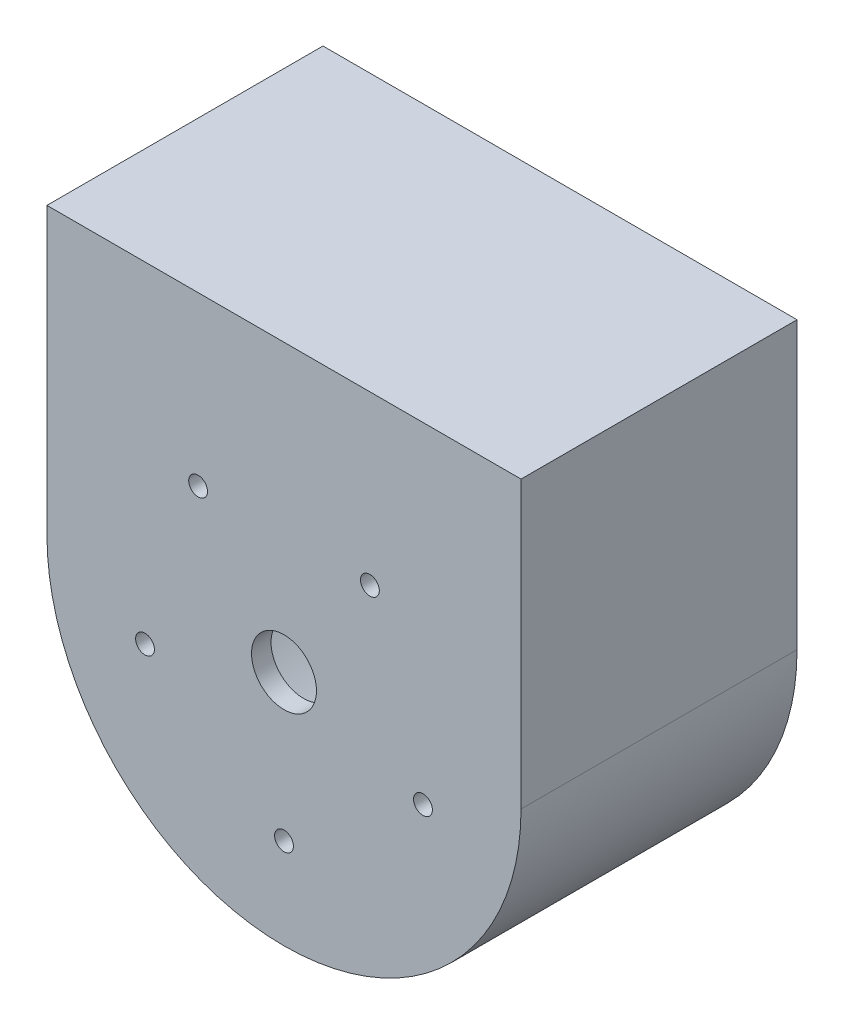
ISO-10303-21;
HEADER;
FILE_DESCRIPTION(('STEP AP214'),'2;1');
FILE_NAME('part.step','',(''),(''),'','','');
FILE_SCHEMA(('AUTOMOTIVE_DESIGN { 1 0 10303 214 1 1 1 1 }'));
ENDSEC;
DATA;
#1=APPLICATION_CONTEXT('core data for automotive mechanical design processes');
#2=APPLICATION_PROTOCOL_DEFINITION('international standard','automotive_design',2000,#1);
#3=PRODUCT_CONTEXT('',#1,'mechanical');
#4=PRODUCT('Part','Part','',(#3));
#5=PRODUCT_RELATED_PRODUCT_CATEGORY('part','',(#4));
#6=PRODUCT_DEFINITION_FORMATION('','',#4);
#7=PRODUCT_DEFINITION_CONTEXT('part definition',#1,'design');
#8=PRODUCT_DEFINITION('design','',#6,#7);
#9=PRODUCT_DEFINITION_SHAPE('','',#8);
#10=(LENGTH_UNIT() NAMED_UNIT(*) SI_UNIT(.MILLI.,.METRE.));
#11=(NAMED_UNIT(*) PLANE_ANGLE_UNIT() SI_UNIT($,.RADIAN.));
#12=(NAMED_UNIT(*) SI_UNIT($,.STERADIAN.) SOLID_ANGLE_UNIT());
#13=UNCERTAINTY_MEASURE_WITH_UNIT(LENGTH_MEASURE(1.E-05),#10,'distance_accuracy_value','');
#14=(GEOMETRIC_REPRESENTATION_CONTEXT(3) GLOBAL_UNCERTAINTY_ASSIGNED_CONTEXT((#13)) GLOBAL_UNIT_ASSIGNED_CONTEXT((#10,
#11,#12)) REPRESENTATION_CONTEXT('',''));
#15=CARTESIAN_POINT('',(0.,0.,0.));
#16=DIRECTION('',(0.,0.,1.));
#17=DIRECTION('',(1.,0.,0.));
#18=AXIS2_PLACEMENT_3D('',#15,#16,#17);
#19=CARTESIAN_POINT('',(300.,300.,389.5));
#20=DIRECTION('',(0.,0.,1.));
#21=DIRECTION('',(1.,0.,0.));
#22=AXIS2_PLACEMENT_3D('',#19,#20,#21);
#23=PLANE('',#22);
#24=CARTESIAN_POINT('',(300.,300.,389.5));
#25=DIRECTION('',(0.,0.,1.));
#26=DIRECTION('',(1.,0.,0.));
#27=AXIS2_PLACEMENT_3D('',#24,#25,#26);
#28=CIRCLE('',#27,31.5);
#29=CARTESIAN_POINT('',(268.5,300.,389.5));
#30=VERTEX_POINT('',#29);
#31=CARTESIAN_POINT('',(331.5,300.,389.5));
#32=VERTEX_POINT('',#31);
#33=EDGE_CURVE('E118',#30,#32,#28,.T.);
#34=ORIENTED_EDGE('',*,*,#33,.F.);
#35=DIRECTION('',(0.,-1.,0.));
#36=VECTOR('',#35,1.);
#37=CARTESIAN_POINT('',(268.5,341.5,389.5));
#38=LINE('',#37,#36);
#39=CARTESIAN_POINT('',(268.5,341.5,389.5));
#40=VERTEX_POINT('',#39);
#41=EDGE_CURVE('E104',#40,#30,#38,.T.);
#42=ORIENTED_EDGE('',*,*,#41,.F.);
#43=DIRECTION('',(-1.,0.,0.));
#44=VECTOR('',#43,1.);
#45=CARTESIAN_POINT('',(331.5,341.5,389.5));
#46=LINE('',#45,#44);
#47=CARTESIAN_POINT('',(331.5,341.5,389.5));
#48=VERTEX_POINT('',#47);
#49=EDGE_CURVE('E323',#48,#40,#46,.T.);
#50=ORIENTED_EDGE('',*,*,#49,.F.);
#51=DIRECTION('',(0.,1.,0.));
#52=VECTOR('',#51,1.);
#53=CARTESIAN_POINT('',(331.5,300.,389.5));
#54=LINE('',#53,#52);
#55=EDGE_CURVE('E54',#32,#48,#54,.T.);
#56=ORIENTED_EDGE('',*,*,#55,.F.);
#57=EDGE_LOOP('',(#34,#42,#50,#56));
#58=FACE_BOUND('',#57,.T.);
#59=CARTESIAN_POINT('',(313.225168176581,318.202882373436,389.5));
#60=DIRECTION('',(0.,0.,1.));
#61=DIRECTION('',(1.,0.,0.));
#62=AXIS2_PLACEMENT_3D('',#59,#60,#61);
#63=CIRCLE('',#62,1.45000000000001);
#64=CARTESIAN_POINT('',(314.675168176581,318.202882373436,389.5));
#65=VERTEX_POINT('',#64);
#66=EDGE_CURVE('E339',#65,#65,#63,.T.);
#67=ORIENTED_EDGE('',*,*,#66,.T.);
#68=EDGE_LOOP('',(#67));
#69=FACE_BOUND('',#68,.T.);
#70=CARTESIAN_POINT('',(321.398771616641,293.047117626564,389.5));
#71=DIRECTION('',(0.,0.,1.));
#72=DIRECTION('',(1.,0.,0.));
#73=AXIS2_PLACEMENT_3D('',#70,#71,#72);
#74=CIRCLE('',#73,1.45000000000001);
#75=CARTESIAN_POINT('',(322.848771616641,293.047117626564,389.5));
#76=VERTEX_POINT('',#75);
#77=EDGE_CURVE('E338',#76,#76,#74,.T.);
#78=ORIENTED_EDGE('',*,*,#77,.T.);
#79=EDGE_LOOP('',(#78));
#80=FACE_BOUND('',#79,.T.);
#81=CARTESIAN_POINT('',(300.,277.5,389.5));
#82=DIRECTION('',(0.,0.,1.));
#83=DIRECTION('',(1.,0.,0.));
#84=AXIS2_PLACEMENT_3D('',#81,#82,#83);
#85=CIRCLE('',#84,1.45000000000001);
#86=CARTESIAN_POINT('',(301.45,277.5,389.5));
#87=VERTEX_POINT('',#86);
#88=EDGE_CURVE('E345',#87,#87,#85,.T.);
#89=ORIENTED_EDGE('',*,*,#88,.T.);
#90=EDGE_LOOP('',(#89));
#91=FACE_BOUND('',#90,.T.);
#92=CARTESIAN_POINT('',(278.601228383359,293.047117626564,389.5));
#93=DIRECTION('',(0.,0.,1.));
#94=DIRECTION('',(1.,0.,0.));
#95=AXIS2_PLACEMENT_3D('',#92,#93,#94);
#96=CIRCLE('',#95,1.45000000000001);
#97=CARTESIAN_POINT('',(280.051228383359,293.047117626564,389.5));
#98=VERTEX_POINT('',#97);
#99=EDGE_CURVE('E351',#98,#98,#96,.T.);
#100=ORIENTED_EDGE('',*,*,#99,.T.);
#101=EDGE_LOOP('',(#100));
#102=FACE_BOUND('',#101,.T.);
#103=CARTESIAN_POINT('',(286.774831823419,318.202882373436,389.5));
#104=DIRECTION('',(0.,0.,1.));
#105=DIRECTION('',(1.,0.,0.));
#106=AXIS2_PLACEMENT_3D('',#103,#104,#105);
#107=CIRCLE('',#106,1.45000000000001);
#108=CARTESIAN_POINT('',(288.224831823419,318.202882373436,389.5));
#109=VERTEX_POINT('',#108);
#110=EDGE_CURVE('E313',#109,#109,#107,.T.);
#111=ORIENTED_EDGE('',*,*,#110,.T.);
#112=EDGE_LOOP('',(#111));
#113=FACE_BOUND('',#112,.T.);
#114=CARTESIAN_POINT('',(300.,300.,389.5));
#115=DIRECTION('',(0.,0.,1.));
#116=DIRECTION('',(1.,0.,0.));
#117=AXIS2_PLACEMENT_3D('',#114,#115,#116);
#118=CIRCLE('',#117,5.);
#119=CARTESIAN_POINT('',(305.,300.,389.5));
#120=VERTEX_POINT('',#119);
#121=EDGE_CURVE('E311',#120,#120,#118,.T.);
#122=ORIENTED_EDGE('',*,*,#121,.T.);
#123=EDGE_LOOP('',(#122));
#124=FACE_BOUND('',#123,.T.);
#125=ADVANCED_FACE('F39',(#58,#69,#80,#91,#102,#113,#124),#23,.F.);
#126=CARTESIAN_POINT('',(300.,300.,350.));
#127=DIRECTION('',(0.,0.,1.));
#128=DIRECTION('',(1.,0.,0.));
#129=AXIS2_PLACEMENT_3D('',#126,#127,#128);
#130=PLANE('',#129);
#131=CARTESIAN_POINT('',(300.,300.,350.));
#132=DIRECTION('',(0.,0.,1.));
#133=DIRECTION('',(1.,0.,0.));
#134=AXIS2_PLACEMENT_3D('',#131,#132,#133);
#135=CIRCLE('',#134,36.5);
#136=CARTESIAN_POINT('',(263.5,300.,350.));
#137=VERTEX_POINT('',#136);
#138=CARTESIAN_POINT('',(336.5,300.,350.));
#139=VERTEX_POINT('',#138);
#140=EDGE_CURVE('E43',#137,#139,#135,.T.);
#141=ORIENTED_EDGE('',*,*,#140,.F.);
#142=DIRECTION('',(0.,-1.,0.));
#143=VECTOR('',#142,1.);
#144=CARTESIAN_POINT('',(263.5,344.,350.));
#145=LINE('',#144,#143);
#146=CARTESIAN_POINT('',(263.5,344.,350.));
#147=VERTEX_POINT('',#146);
#148=EDGE_CURVE('E124',#147,#137,#145,.T.);
#149=ORIENTED_EDGE('',*,*,#148,.F.);
#150=DIRECTION('',(-1.,0.,0.));
#151=VECTOR('',#150,1.);
#152=CARTESIAN_POINT('',(336.5,344.,350.));
#153=LINE('',#152,#151);
#154=CARTESIAN_POINT('',(336.5,344.,350.));
#155=VERTEX_POINT('',#154);
#156=EDGE_CURVE('E135',#155,#147,#153,.T.);
#157=ORIENTED_EDGE('',*,*,#156,.F.);
#158=DIRECTION('',(0.,1.,0.));
#159=VECTOR('',#158,1.);
#160=CARTESIAN_POINT('',(336.5,300.,350.));
#161=LINE('',#160,#159);
#162=EDGE_CURVE('E127',#139,#155,#161,.T.);
#163=ORIENTED_EDGE('',*,*,#162,.F.);
#164=EDGE_LOOP('',(#141,#149,#157,#163));
#165=FACE_BOUND('',#164,.T.);
#166=DIRECTION('',(0.,-1.,0.));
#167=VECTOR('',#166,1.);
#168=CARTESIAN_POINT('',(268.5,341.5,350.));
#169=LINE('',#168,#167);
#170=CARTESIAN_POINT('',(268.5,341.5,350.));
#171=VERTEX_POINT('',#170);
#172=CARTESIAN_POINT('',(268.5,300.,350.));
#173=VERTEX_POINT('',#172);
#174=EDGE_CURVE('E315',#171,#173,#169,.T.);
#175=ORIENTED_EDGE('',*,*,#174,.T.);
#176=CARTESIAN_POINT('',(300.,300.,350.));
#177=DIRECTION('',(0.,0.,1.));
#178=DIRECTION('',(1.,0.,0.));
#179=AXIS2_PLACEMENT_3D('',#176,#177,#178);
#180=CIRCLE('',#179,31.5);
#181=CARTESIAN_POINT('',(331.5,300.,350.));
#182=VERTEX_POINT('',#181);
#183=EDGE_CURVE('E120',#173,#182,#180,.T.);
#184=ORIENTED_EDGE('',*,*,#183,.T.);
#185=DIRECTION('',(0.,1.,0.));
#186=VECTOR('',#185,1.);
#187=CARTESIAN_POINT('',(331.5,300.,350.));
#188=LINE('',#187,#186);
#189=CARTESIAN_POINT('',(331.5,341.5,350.));
#190=VERTEX_POINT('',#189);
#191=EDGE_CURVE('E326',#182,#190,#188,.T.);
#192=ORIENTED_EDGE('',*,*,#191,.T.);
#193=DIRECTION('',(-1.,0.,0.));
#194=VECTOR('',#193,1.);
#195=CARTESIAN_POINT('',(331.5,341.5,350.));
#196=LINE('',#195,#194);
#197=EDGE_CURVE('E111',#190,#171,#196,.T.);
#198=ORIENTED_EDGE('',*,*,#197,.T.);
#199=EDGE_LOOP('',(#175,#184,#192,#198));
#200=FACE_BOUND('',#199,.T.);
#201=ADVANCED_FACE('F160',(#165,#200),#130,.F.);
#202=CARTESIAN_POINT('',(300.,300.,389.5));
#203=DIRECTION('',(0.,0.,-1.));
#204=DIRECTION('',(-1.,0.,0.));
#205=AXIS2_PLACEMENT_3D('',#202,#203,#204);
#206=CYLINDRICAL_SURFACE('',#205,31.5);
#207=ORIENTED_EDGE('',*,*,#183,.F.);
#208=DIRECTION('',(0.,0.,-1.));
#209=VECTOR('',#208,1.);
#210=CARTESIAN_POINT('',(268.5,300.,389.5));
#211=LINE('',#210,#209);
#212=EDGE_CURVE('E108',#30,#173,#211,.T.);
#213=ORIENTED_EDGE('',*,*,#212,.F.);
#214=ORIENTED_EDGE('',*,*,#33,.T.);
#215=DIRECTION('',(0.,0.,-1.));
#216=VECTOR('',#215,1.);
#217=CARTESIAN_POINT('',(331.5,300.,389.5));
#218=LINE('',#217,#216);
#219=EDGE_CURVE('E121',#32,#182,#218,.T.);
#220=ORIENTED_EDGE('',*,*,#219,.T.);
#221=EDGE_LOOP('',(#207,#213,#214,#220));
#222=FACE_BOUND('',#221,.T.);
#223=ADVANCED_FACE('F116',(#222),#206,.F.);
#224=CARTESIAN_POINT('',(300.,300.,392.5));
#225=DIRECTION('',(0.,0.,-1.));
#226=DIRECTION('',(-1.,0.,0.));
#227=AXIS2_PLACEMENT_3D('',#224,#225,#226);
#228=CYLINDRICAL_SURFACE('',#227,36.5);
#229=DIRECTION('',(0.,0.,-1.));
#230=VECTOR('',#229,1.);
#231=CARTESIAN_POINT('',(263.5,300.,392.5));
#232=LINE('',#231,#230);
#233=CARTESIAN_POINT('',(263.5,300.,392.5));
#234=VERTEX_POINT('',#233);
#235=EDGE_CURVE('E150',#234,#137,#232,.T.);
#236=ORIENTED_EDGE('',*,*,#235,.T.);
#237=ORIENTED_EDGE('',*,*,#140,.T.);
#238=DIRECTION('',(0.,0.,-1.));
#239=VECTOR('',#238,1.);
#240=CARTESIAN_POINT('',(336.5,300.,392.5));
#241=LINE('',#240,#239);
#242=CARTESIAN_POINT('',(336.5,300.,392.5));
#243=VERTEX_POINT('',#242);
#244=EDGE_CURVE('E147',#243,#139,#241,.T.);
#245=ORIENTED_EDGE('',*,*,#244,.F.);
#246=CARTESIAN_POINT('',(300.,300.,392.5));
#247=DIRECTION('',(0.,0.,1.));
#248=DIRECTION('',(1.,0.,0.));
#249=AXIS2_PLACEMENT_3D('',#246,#247,#248);
#250=CIRCLE('',#249,36.5);
#251=EDGE_CURVE('E11',#234,#243,#250,.T.);
#252=ORIENTED_EDGE('',*,*,#251,.F.);
#253=EDGE_LOOP('',(#236,#237,#245,#252));
#254=FACE_BOUND('',#253,.T.);
#255=ADVANCED_FACE('F41',(#254),#228,.T.);
#256=CARTESIAN_POINT('',(300.,300.,392.5));
#257=DIRECTION('',(0.,0.,1.));
#258=DIRECTION('',(1.,0.,0.));
#259=AXIS2_PLACEMENT_3D('',#256,#257,#258);
#260=PLANE('',#259);
#261=CARTESIAN_POINT('',(286.774831823419,318.202882373436,392.5));
#262=DIRECTION('',(0.,0.,1.));
#263=DIRECTION('',(1.,0.,0.));
#264=AXIS2_PLACEMENT_3D('',#261,#262,#263);
#265=CIRCLE('',#264,1.45000000000001);
#266=CARTESIAN_POINT('',(288.224831823419,318.202882373436,392.5));
#267=VERTEX_POINT('',#266);
#268=EDGE_CURVE('E318',#267,#267,#265,.T.);
#269=ORIENTED_EDGE('',*,*,#268,.F.);
#270=EDGE_LOOP('',(#269));
#271=FACE_BOUND('',#270,.T.);
#272=CARTESIAN_POINT('',(278.601228383359,293.047117626564,392.5));
#273=DIRECTION('',(0.,0.,1.));
#274=DIRECTION('',(1.,0.,0.));
#275=AXIS2_PLACEMENT_3D('',#272,#273,#274);
#276=CIRCLE('',#275,1.45000000000001);
#277=CARTESIAN_POINT('',(280.051228383359,293.047117626564,392.5));
#278=VERTEX_POINT('',#277);
#279=EDGE_CURVE('E348',#278,#278,#276,.T.);
#280=ORIENTED_EDGE('',*,*,#279,.F.);
#281=EDGE_LOOP('',(#280));
#282=FACE_BOUND('',#281,.T.);
#283=CARTESIAN_POINT('',(300.,277.5,392.5));
#284=DIRECTION('',(0.,0.,1.));
#285=DIRECTION('',(1.,0.,0.));
#286=AXIS2_PLACEMENT_3D('',#283,#284,#285);
#287=CIRCLE('',#286,1.45000000000001);
#288=CARTESIAN_POINT('',(301.45,277.5,392.5));
#289=VERTEX_POINT('',#288);
#290=EDGE_CURVE('E342',#289,#289,#287,.T.);
#291=ORIENTED_EDGE('',*,*,#290,.F.);
#292=EDGE_LOOP('',(#291));
#293=FACE_BOUND('',#292,.T.);
#294=CARTESIAN_POINT('',(321.398771616641,293.047117626564,392.5));
#295=DIRECTION('',(0.,0.,1.));
#296=DIRECTION('',(1.,0.,0.));
#297=AXIS2_PLACEMENT_3D('',#294,#295,#296);
#298=CIRCLE('',#297,1.45000000000001);
#299=CARTESIAN_POINT('',(322.848771616641,293.047117626564,392.5));
#300=VERTEX_POINT('',#299);
#301=EDGE_CURVE('E335',#300,#300,#298,.T.);
#302=ORIENTED_EDGE('',*,*,#301,.F.);
#303=EDGE_LOOP('',(#302));
#304=FACE_BOUND('',#303,.T.);
#305=CARTESIAN_POINT('',(313.225168176581,318.202882373436,392.5));
#306=DIRECTION('',(0.,0.,1.));
#307=DIRECTION('',(1.,0.,0.));
#308=AXIS2_PLACEMENT_3D('',#305,#306,#307);
#309=CIRCLE('',#308,1.45000000000001);
#310=CARTESIAN_POINT('',(314.675168176581,318.202882373436,392.5));
#311=VERTEX_POINT('',#310);
#312=EDGE_CURVE('E356',#311,#311,#309,.T.);
#313=ORIENTED_EDGE('',*,*,#312,.F.);
#314=EDGE_LOOP('',(#313));
#315=FACE_BOUND('',#314,.T.);
#316=CARTESIAN_POINT('',(300.,300.,392.5));
#317=DIRECTION('',(0.,0.,1.));
#318=DIRECTION('',(1.,0.,0.));
#319=AXIS2_PLACEMENT_3D('',#316,#317,#318);
#320=CIRCLE('',#319,5.);
#321=CARTESIAN_POINT('',(305.,300.,392.5));
#322=VERTEX_POINT('',#321);
#323=EDGE_CURVE('E308',#322,#322,#320,.T.);
#324=ORIENTED_EDGE('',*,*,#323,.F.);
#325=EDGE_LOOP('',(#324));
#326=FACE_BOUND('',#325,.T.);
#327=ORIENTED_EDGE('',*,*,#251,.T.);
#328=DIRECTION('',(0.,1.,0.));
#329=VECTOR('',#328,1.);
#330=CARTESIAN_POINT('',(336.5,300.,392.5));
#331=LINE('',#330,#329);
#332=CARTESIAN_POINT('',(336.5,344.,392.5));
#333=VERTEX_POINT('',#332);
#334=EDGE_CURVE('E134',#243,#333,#331,.T.);
#335=ORIENTED_EDGE('',*,*,#334,.T.);
#336=DIRECTION('',(-1.,0.,0.));
#337=VECTOR('',#336,1.);
#338=CARTESIAN_POINT('',(336.5,344.,392.5));
#339=LINE('',#338,#337);
#340=CARTESIAN_POINT('',(263.5,344.,392.5));
#341=VERTEX_POINT('',#340);
#342=EDGE_CURVE('E137',#333,#341,#339,.T.);
#343=ORIENTED_EDGE('',*,*,#342,.T.);
#344=DIRECTION('',(0.,-1.,0.));
#345=VECTOR('',#344,1.);
#346=CARTESIAN_POINT('',(263.5,344.,392.5));
#347=LINE('',#346,#345);
#348=EDGE_CURVE('E132',#341,#234,#347,.T.);
#349=ORIENTED_EDGE('',*,*,#348,.T.);
#350=EDGE_LOOP('',(#327,#335,#343,#349));
#351=FACE_BOUND('',#350,.T.);
#352=ADVANCED_FACE('F170',(#271,#282,#293,#304,#315,#326,#351),#260,.T.);
#353=CARTESIAN_POINT('',(263.5,344.,392.5));
#354=DIRECTION('',(1.,0.,0.));
#355=DIRECTION('',(0.,0.,-1.));
#356=AXIS2_PLACEMENT_3D('',#353,#354,#355);
#357=PLANE('',#356);
#358=ORIENTED_EDGE('',*,*,#148,.T.);
#359=ORIENTED_EDGE('',*,*,#235,.F.);
#360=ORIENTED_EDGE('',*,*,#348,.F.);
#361=DIRECTION('',(0.,0.,-1.));
#362=VECTOR('',#361,1.);
#363=CARTESIAN_POINT('',(263.5,344.,392.5));
#364=LINE('',#363,#362);
#365=EDGE_CURVE('E138',#341,#147,#364,.T.);
#366=ORIENTED_EDGE('',*,*,#365,.T.);
#367=EDGE_LOOP('',(#358,#359,#360,#366));
#368=FACE_BOUND('',#367,.T.);
#369=ADVANCED_FACE('F168',(#368),#357,.F.);
#370=CARTESIAN_POINT('',(336.5,300.,392.5));
#371=DIRECTION('',(-1.,0.,0.));
#372=DIRECTION('',(0.,0.,1.));
#373=AXIS2_PLACEMENT_3D('',#370,#371,#372);
#374=PLANE('',#373);
#375=ORIENTED_EDGE('',*,*,#162,.T.);
#376=DIRECTION('',(0.,0.,-1.));
#377=VECTOR('',#376,1.);
#378=CARTESIAN_POINT('',(336.5,344.,392.5));
#379=LINE('',#378,#377);
#380=EDGE_CURVE('E144',#333,#155,#379,.T.);
#381=ORIENTED_EDGE('',*,*,#380,.F.);
#382=ORIENTED_EDGE('',*,*,#334,.F.);
#383=ORIENTED_EDGE('',*,*,#244,.T.);
#384=EDGE_LOOP('',(#375,#381,#382,#383));
#385=FACE_BOUND('',#384,.T.);
#386=ADVANCED_FACE('F157',(#385),#374,.F.);
#387=CARTESIAN_POINT('',(336.5,344.,392.5));
#388=DIRECTION('',(0.,-1.,0.));
#389=DIRECTION('',(0.,0.,-1.));
#390=AXIS2_PLACEMENT_3D('',#387,#388,#389);
#391=PLANE('',#390);
#392=ORIENTED_EDGE('',*,*,#156,.T.);
#393=ORIENTED_EDGE('',*,*,#365,.F.);
#394=ORIENTED_EDGE('',*,*,#342,.F.);
#395=ORIENTED_EDGE('',*,*,#380,.T.);
#396=EDGE_LOOP('',(#392,#393,#394,#395));
#397=FACE_BOUND('',#396,.T.);
#398=ADVANCED_FACE('F164',(#397),#391,.F.);
#399=CARTESIAN_POINT('',(268.5,341.5,389.5));
#400=DIRECTION('',(1.,0.,0.));
#401=DIRECTION('',(0.,0.,-1.));
#402=AXIS2_PLACEMENT_3D('',#399,#400,#401);
#403=PLANE('',#402);
#404=ORIENTED_EDGE('',*,*,#174,.F.);
#405=DIRECTION('',(0.,0.,-1.));
#406=VECTOR('',#405,1.);
#407=CARTESIAN_POINT('',(268.5,341.5,389.5));
#408=LINE('',#407,#406);
#409=EDGE_CURVE('E110',#40,#171,#408,.T.);
#410=ORIENTED_EDGE('',*,*,#409,.F.);
#411=ORIENTED_EDGE('',*,*,#41,.T.);
#412=ORIENTED_EDGE('',*,*,#212,.T.);
#413=EDGE_LOOP('',(#404,#410,#411,#412));
#414=FACE_BOUND('',#413,.T.);
#415=ADVANCED_FACE('F107',(#414),#403,.T.);
#416=CARTESIAN_POINT('',(331.5,300.,389.5));
#417=DIRECTION('',(-1.,0.,0.));
#418=DIRECTION('',(0.,0.,1.));
#419=AXIS2_PLACEMENT_3D('',#416,#417,#418);
#420=PLANE('',#419);
#421=ORIENTED_EDGE('',*,*,#191,.F.);
#422=ORIENTED_EDGE('',*,*,#219,.F.);
#423=ORIENTED_EDGE('',*,*,#55,.T.);
#424=DIRECTION('',(0.,0.,-1.));
#425=VECTOR('',#424,1.);
#426=CARTESIAN_POINT('',(331.5,341.5,389.5));
#427=LINE('',#426,#425);
#428=EDGE_CURVE('E332',#48,#190,#427,.T.);
#429=ORIENTED_EDGE('',*,*,#428,.T.);
#430=EDGE_LOOP('',(#421,#422,#423,#429));
#431=FACE_BOUND('',#430,.T.);
#432=ADVANCED_FACE('F221',(#431),#420,.T.);
#433=CARTESIAN_POINT('',(331.5,341.5,389.5));
#434=DIRECTION('',(0.,-1.,0.));
#435=DIRECTION('',(0.,0.,-1.));
#436=AXIS2_PLACEMENT_3D('',#433,#434,#435);
#437=PLANE('',#436);
#438=ORIENTED_EDGE('',*,*,#197,.F.);
#439=ORIENTED_EDGE('',*,*,#428,.F.);
#440=ORIENTED_EDGE('',*,*,#49,.T.);
#441=ORIENTED_EDGE('',*,*,#409,.T.);
#442=EDGE_LOOP('',(#438,#439,#440,#441));
#443=FACE_BOUND('',#442,.T.);
#444=ADVANCED_FACE('F226',(#443),#437,.T.);
#445=CARTESIAN_POINT('',(313.225168176581,318.202882373436,392.5));
#446=DIRECTION('',(0.,0.,-1.));
#447=DIRECTION('',(-1.,0.,0.));
#448=AXIS2_PLACEMENT_3D('',#445,#446,#447);
#449=CYLINDRICAL_SURFACE('',#448,1.45000000000001);
#450=ORIENTED_EDGE('',*,*,#312,.T.);
#451=EDGE_LOOP('',(#450));
#452=FACE_BOUND('',#451,.T.);
#453=ORIENTED_EDGE('',*,*,#66,.F.);
#454=EDGE_LOOP('',(#453));
#455=FACE_BOUND('',#454,.T.);
#456=ADVANCED_FACE('F233',(#452,#455),#449,.F.);
#457=CARTESIAN_POINT('',(321.398771616641,293.047117626564,392.5));
#458=DIRECTION('',(0.,0.,-1.));
#459=DIRECTION('',(-1.,0.,0.));
#460=AXIS2_PLACEMENT_3D('',#457,#458,#459);
#461=CYLINDRICAL_SURFACE('',#460,1.45000000000001);
#462=ORIENTED_EDGE('',*,*,#301,.T.);
#463=EDGE_LOOP('',(#462));
#464=FACE_BOUND('',#463,.T.);
#465=ORIENTED_EDGE('',*,*,#77,.F.);
#466=EDGE_LOOP('',(#465));
#467=FACE_BOUND('',#466,.T.);
#468=ADVANCED_FACE('F252',(#464,#467),#461,.F.);
#469=CARTESIAN_POINT('',(300.,277.5,392.5));
#470=DIRECTION('',(0.,0.,-1.));
#471=DIRECTION('',(-1.,0.,0.));
#472=AXIS2_PLACEMENT_3D('',#469,#470,#471);
#473=CYLINDRICAL_SURFACE('',#472,1.45000000000001);
#474=ORIENTED_EDGE('',*,*,#290,.T.);
#475=EDGE_LOOP('',(#474));
#476=FACE_BOUND('',#475,.T.);
#477=ORIENTED_EDGE('',*,*,#88,.F.);
#478=EDGE_LOOP('',(#477));
#479=FACE_BOUND('',#478,.T.);
#480=ADVANCED_FACE('F262',(#476,#479),#473,.F.);
#481=CARTESIAN_POINT('',(278.601228383359,293.047117626564,392.5));
#482=DIRECTION('',(0.,0.,-1.));
#483=DIRECTION('',(-1.,0.,0.));
#484=AXIS2_PLACEMENT_3D('',#481,#482,#483);
#485=CYLINDRICAL_SURFACE('',#484,1.45000000000001);
#486=ORIENTED_EDGE('',*,*,#279,.T.);
#487=EDGE_LOOP('',(#486));
#488=FACE_BOUND('',#487,.T.);
#489=ORIENTED_EDGE('',*,*,#99,.F.);
#490=EDGE_LOOP('',(#489));
#491=FACE_BOUND('',#490,.T.);
#492=ADVANCED_FACE('F272',(#488,#491),#485,.F.);
#493=CARTESIAN_POINT('',(286.774831823419,318.202882373436,392.5));
#494=DIRECTION('',(0.,0.,-1.));
#495=DIRECTION('',(-1.,0.,0.));
#496=AXIS2_PLACEMENT_3D('',#493,#494,#495);
#497=CYLINDRICAL_SURFACE('',#496,1.45000000000001);
#498=ORIENTED_EDGE('',*,*,#268,.T.);
#499=EDGE_LOOP('',(#498));
#500=FACE_BOUND('',#499,.T.);
#501=ORIENTED_EDGE('',*,*,#110,.F.);
#502=EDGE_LOOP('',(#501));
#503=FACE_BOUND('',#502,.T.);
#504=ADVANCED_FACE('F282',(#500,#503),#497,.F.);
#505=CARTESIAN_POINT('',(300.,300.,392.5));
#506=DIRECTION('',(0.,0.,-1.));
#507=DIRECTION('',(-1.,0.,0.));
#508=AXIS2_PLACEMENT_3D('',#505,#506,#507);
#509=CYLINDRICAL_SURFACE('',#508,5.);
#510=ORIENTED_EDGE('',*,*,#323,.T.);
#511=EDGE_LOOP('',(#510));
#512=FACE_BOUND('',#511,.T.);
#513=ORIENTED_EDGE('',*,*,#121,.F.);
#514=EDGE_LOOP('',(#513));
#515=FACE_BOUND('',#514,.T.);
#516=ADVANCED_FACE('F292',(#512,#515),#509,.F.);
#517=CLOSED_SHELL('',(#125,#201,#223,#255,#352,#369,#386,#398,#415,#432,#444,#456,#468,#480,
#492,#504,#516));
#518=MANIFOLD_SOLID_BREP('B2',#517);
#519=ADVANCED_BREP_SHAPE_REPRESENTATION('',(#18,#518),#14);
#520=SHAPE_DEFINITION_REPRESENTATION(#9,#519);
ENDSEC;
END-ISO-10303-21;
